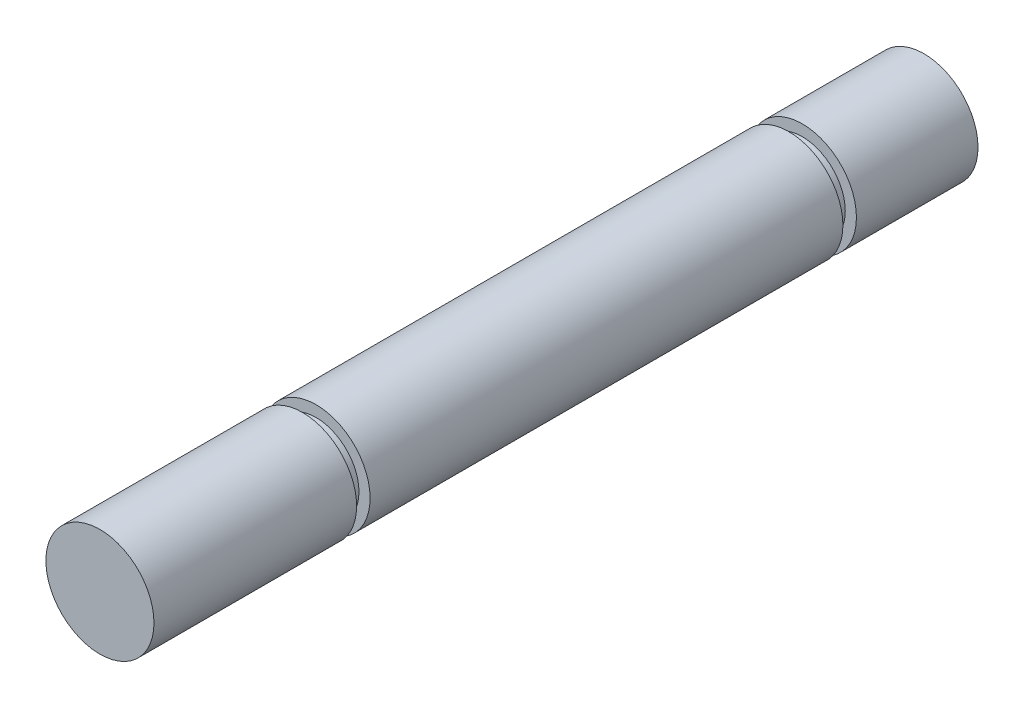
ISO-10303-21;
HEADER;
FILE_DESCRIPTION(('STEP AP214'),'2;1');
FILE_NAME('part.step','',(''),(''),'','','');
FILE_SCHEMA(('AUTOMOTIVE_DESIGN { 1 0 10303 214 1 1 1 1 }'));
ENDSEC;
DATA;
#1=APPLICATION_CONTEXT('core data for automotive mechanical design processes');
#2=APPLICATION_PROTOCOL_DEFINITION('international standard','automotive_design',2000,#1);
#3=PRODUCT_CONTEXT('',#1,'mechanical');
#4=PRODUCT('Part','Part','',(#3));
#5=PRODUCT_RELATED_PRODUCT_CATEGORY('part','',(#4));
#6=PRODUCT_DEFINITION_FORMATION('','',#4);
#7=PRODUCT_DEFINITION_CONTEXT('part definition',#1,'design');
#8=PRODUCT_DEFINITION('design','',#6,#7);
#9=PRODUCT_DEFINITION_SHAPE('','',#8);
#10=(LENGTH_UNIT() NAMED_UNIT(*) SI_UNIT(.MILLI.,.METRE.));
#11=(NAMED_UNIT(*) PLANE_ANGLE_UNIT() SI_UNIT($,.RADIAN.));
#12=(NAMED_UNIT(*) SI_UNIT($,.STERADIAN.) SOLID_ANGLE_UNIT());
#13=UNCERTAINTY_MEASURE_WITH_UNIT(LENGTH_MEASURE(1.E-05),#10,'distance_accuracy_value','');
#14=(GEOMETRIC_REPRESENTATION_CONTEXT(3) GLOBAL_UNCERTAINTY_ASSIGNED_CONTEXT((#13)) GLOBAL_UNIT_ASSIGNED_CONTEXT((#10,
#11,#12)) REPRESENTATION_CONTEXT('',''));
#15=CARTESIAN_POINT('',(0.,0.,0.));
#16=DIRECTION('',(0.,0.,1.));
#17=DIRECTION('',(1.,0.,0.));
#18=AXIS2_PLACEMENT_3D('',#15,#16,#17);
#19=CARTESIAN_POINT('',(0.,4.,16.));
#20=DIRECTION('',(0.,0.,-1.));
#21=DIRECTION('',(1.,0.,0.));
#22=AXIS2_PLACEMENT_3D('',#19,#20,#21);
#23=PLANE('',#22);
#24=CARTESIAN_POINT('',(0.,0.,16.));
#25=DIRECTION('',(0.,0.,1.));
#26=DIRECTION('',(1.,0.,0.));
#27=AXIS2_PLACEMENT_3D('',#24,#25,#26);
#28=CIRCLE('',#27,4.);
#29=CARTESIAN_POINT('',(4.00000000000001,0.,16.));
#30=VERTEX_POINT('',#29);
#31=EDGE_CURVE('E37',#30,#30,#28,.T.);
#32=ORIENTED_EDGE('',*,*,#31,.T.);
#33=EDGE_LOOP('',(#32));
#34=FACE_BOUND('',#33,.T.);
#35=ADVANCED_FACE('F34',(#34),#23,.F.);
#36=CARTESIAN_POINT('',(0.,4.,-45.));
#37=DIRECTION('',(0.,0.,-1.));
#38=DIRECTION('',(1.,0.,0.));
#39=AXIS2_PLACEMENT_3D('',#36,#37,#38);
#40=PLANE('',#39);
#41=CARTESIAN_POINT('',(0.,0.,-45.));
#42=DIRECTION('',(0.,0.,1.));
#43=DIRECTION('',(1.,0.,0.));
#44=AXIS2_PLACEMENT_3D('',#41,#42,#43);
#45=CIRCLE('',#44,4.);
#46=CARTESIAN_POINT('',(4.00000000000001,0.,-45.));
#47=VERTEX_POINT('',#46);
#48=EDGE_CURVE('E52',#47,#47,#45,.F.);
#49=ORIENTED_EDGE('',*,*,#48,.T.);
#50=EDGE_LOOP('',(#49));
#51=FACE_BOUND('',#50,.T.);
#52=ADVANCED_FACE('F107',(#51),#40,.T.);
#53=CARTESIAN_POINT('',(0.,0.,-45.002));
#54=DIRECTION('',(0.,0.,-1.));
#55=DIRECTION('',(1.,0.,0.));
#56=AXIS2_PLACEMENT_3D('',#53,#54,#55);
#57=CYLINDRICAL_SURFACE('',#56,4.);
#58=ORIENTED_EDGE('',*,*,#31,.F.);
#59=EDGE_LOOP('',(#58));
#60=FACE_BOUND('',#59,.T.);
#61=CARTESIAN_POINT('',(0.,0.,1.));
#62=DIRECTION('',(0.,0.,1.));
#63=DIRECTION('',(1.,0.,0.));
#64=AXIS2_PLACEMENT_3D('',#61,#62,#63);
#65=CIRCLE('',#64,4.);
#66=CARTESIAN_POINT('',(-3.99999999999999,0.,1.));
#67=VERTEX_POINT('',#66);
#68=EDGE_CURVE('E98',#67,#67,#65,.F.);
#69=ORIENTED_EDGE('',*,*,#68,.F.);
#70=EDGE_LOOP('',(#69));
#71=FACE_BOUND('',#70,.T.);
#72=ADVANCED_FACE('F104',(#60,#71),#57,.T.);
#73=CARTESIAN_POINT('',(0.,0.,-45.002));
#74=DIRECTION('',(0.,0.,-1.));
#75=DIRECTION('',(1.,0.,0.));
#76=AXIS2_PLACEMENT_3D('',#73,#74,#75);
#77=CYLINDRICAL_SURFACE('',#76,4.);
#78=ORIENTED_EDGE('',*,*,#48,.F.);
#79=EDGE_LOOP('',(#78));
#80=FACE_BOUND('',#79,.T.);
#81=CARTESIAN_POINT('',(0.,0.,-36.));
#82=DIRECTION('',(0.,0.,1.));
#83=DIRECTION('',(1.,0.,0.));
#84=AXIS2_PLACEMENT_3D('',#81,#82,#83);
#85=CIRCLE('',#84,4.);
#86=CARTESIAN_POINT('',(4.00000000000001,0.,-36.));
#87=VERTEX_POINT('',#86);
#88=EDGE_CURVE('E96',#87,#87,#85,.T.);
#89=ORIENTED_EDGE('',*,*,#88,.F.);
#90=EDGE_LOOP('',(#89));
#91=FACE_BOUND('',#90,.T.);
#92=ADVANCED_FACE('F106',(#80,#91),#77,.T.);
#93=CARTESIAN_POINT('',(0.,4.,1.));
#94=DIRECTION('',(0.,0.,1.));
#95=DIRECTION('',(-1.,0.,0.));
#96=AXIS2_PLACEMENT_3D('',#93,#94,#95);
#97=PLANE('',#96);
#98=ORIENTED_EDGE('',*,*,#68,.T.);
#99=EDGE_LOOP('',(#98));
#100=FACE_BOUND('',#99,.T.);
#101=CARTESIAN_POINT('',(0.,0.,1.));
#102=DIRECTION('',(0.,0.,-1.));
#103=DIRECTION('',(-1.,0.,0.));
#104=AXIS2_PLACEMENT_3D('',#101,#102,#103);
#105=CIRCLE('',#104,3.175);
#106=CARTESIAN_POINT('',(-3.17499999999999,0.,1.));
#107=VERTEX_POINT('',#106);
#108=EDGE_CURVE('E94',#107,#107,#105,.F.);
#109=ORIENTED_EDGE('',*,*,#108,.T.);
#110=EDGE_LOOP('',(#109));
#111=FACE_BOUND('',#110,.T.);
#112=ADVANCED_FACE('F101',(#100,#111),#97,.F.);
#113=CARTESIAN_POINT('',(0.,4.,-36.));
#114=DIRECTION('',(0.,0.,-1.));
#115=DIRECTION('',(1.,0.,0.));
#116=AXIS2_PLACEMENT_3D('',#113,#114,#115);
#117=PLANE('',#116);
#118=CARTESIAN_POINT('',(0.,0.,-36.));
#119=DIRECTION('',(0.,0.,1.));
#120=DIRECTION('',(1.,0.,0.));
#121=AXIS2_PLACEMENT_3D('',#118,#119,#120);
#122=CIRCLE('',#121,3.175);
#123=CARTESIAN_POINT('',(3.17500000000001,0.,-36.));
#124=VERTEX_POINT('',#123);
#125=EDGE_CURVE('E92',#124,#124,#122,.F.);
#126=ORIENTED_EDGE('',*,*,#125,.T.);
#127=EDGE_LOOP('',(#126));
#128=FACE_BOUND('',#127,.T.);
#129=ORIENTED_EDGE('',*,*,#88,.T.);
#130=EDGE_LOOP('',(#129));
#131=FACE_BOUND('',#130,.T.);
#132=ADVANCED_FACE('F144',(#128,#131),#117,.F.);
#133=CARTESIAN_POINT('',(0.,0.,1.002));
#134=DIRECTION('',(0.,0.,1.));
#135=DIRECTION('',(-1.,0.,0.));
#136=AXIS2_PLACEMENT_3D('',#133,#134,#135);
#137=CYLINDRICAL_SURFACE('',#136,3.175);
#138=ORIENTED_EDGE('',*,*,#108,.F.);
#139=EDGE_LOOP('',(#138));
#140=FACE_BOUND('',#139,.T.);
#141=CARTESIAN_POINT('',(0.,0.,0.));
#142=DIRECTION('',(0.,0.,-1.));
#143=DIRECTION('',(-1.,0.,0.));
#144=AXIS2_PLACEMENT_3D('',#141,#142,#143);
#145=CIRCLE('',#144,3.175);
#146=CARTESIAN_POINT('',(3.17500000000001,0.,0.));
#147=VERTEX_POINT('',#146);
#148=EDGE_CURVE('E88',#147,#147,#145,.T.);
#149=ORIENTED_EDGE('',*,*,#148,.F.);
#150=EDGE_LOOP('',(#149));
#151=FACE_BOUND('',#150,.T.);
#152=ADVANCED_FACE('F153',(#140,#151),#137,.T.);
#153=CARTESIAN_POINT('',(0.,0.,-36.002));
#154=DIRECTION('',(0.,0.,-1.));
#155=DIRECTION('',(1.,0.,0.));
#156=AXIS2_PLACEMENT_3D('',#153,#154,#155);
#157=CYLINDRICAL_SURFACE('',#156,3.175);
#158=ORIENTED_EDGE('',*,*,#125,.F.);
#159=EDGE_LOOP('',(#158));
#160=FACE_BOUND('',#159,.T.);
#161=CARTESIAN_POINT('',(0.,0.,-35.));
#162=DIRECTION('',(0.,0.,1.));
#163=DIRECTION('',(1.,0.,0.));
#164=AXIS2_PLACEMENT_3D('',#161,#162,#163);
#165=CIRCLE('',#164,3.175);
#166=CARTESIAN_POINT('',(3.17500000000001,0.,-35.));
#167=VERTEX_POINT('',#166);
#168=EDGE_CURVE('E86',#167,#167,#165,.F.);
#169=ORIENTED_EDGE('',*,*,#168,.T.);
#170=EDGE_LOOP('',(#169));
#171=FACE_BOUND('',#170,.T.);
#172=ADVANCED_FACE('F163',(#160,#171),#157,.T.);
#173=CARTESIAN_POINT('',(-7.75,-59.1416059881449,0.));
#174=DIRECTION('',(0.,0.,-1.));
#175=DIRECTION('',(1.,0.,0.));
#176=AXIS2_PLACEMENT_3D('',#173,#174,#175);
#177=PLANE('',#176);
#178=CARTESIAN_POINT('',(0.,0.,0.));
#179=DIRECTION('',(0.,0.,1.));
#180=DIRECTION('',(1.,0.,0.));
#181=AXIS2_PLACEMENT_3D('',#178,#179,#180);
#182=CIRCLE('',#181,4.);
#183=CARTESIAN_POINT('',(4.00000000000001,0.,0.));
#184=VERTEX_POINT('',#183);
#185=EDGE_CURVE('E42',#184,#184,#182,.T.);
#186=ORIENTED_EDGE('',*,*,#185,.T.);
#187=EDGE_LOOP('',(#186));
#188=FACE_BOUND('',#187,.T.);
#189=ORIENTED_EDGE('',*,*,#148,.T.);
#190=EDGE_LOOP('',(#189));
#191=FACE_BOUND('',#190,.T.);
#192=ADVANCED_FACE('F173',(#188,#191),#177,.F.);
#193=CARTESIAN_POINT('',(0.,11.,-35.));
#194=DIRECTION('',(0.,0.,-1.));
#195=DIRECTION('',(1.,0.,0.));
#196=AXIS2_PLACEMENT_3D('',#193,#194,#195);
#197=PLANE('',#196);
#198=CARTESIAN_POINT('',(0.,0.,-35.));
#199=DIRECTION('',(0.,0.,1.));
#200=DIRECTION('',(1.,0.,0.));
#201=AXIS2_PLACEMENT_3D('',#198,#199,#200);
#202=CIRCLE('',#201,4.);
#203=CARTESIAN_POINT('',(4.00000000000001,0.,-35.));
#204=VERTEX_POINT('',#203);
#205=EDGE_CURVE('E11',#204,#204,#202,.F.);
#206=ORIENTED_EDGE('',*,*,#205,.T.);
#207=EDGE_LOOP('',(#206));
#208=FACE_BOUND('',#207,.T.);
#209=ORIENTED_EDGE('',*,*,#168,.F.);
#210=EDGE_LOOP('',(#209));
#211=FACE_BOUND('',#210,.T.);
#212=ADVANCED_FACE('F77',(#208,#211),#197,.T.);
#213=CARTESIAN_POINT('',(0.,0.,-45.002));
#214=DIRECTION('',(0.,0.,-1.));
#215=DIRECTION('',(1.,0.,0.));
#216=AXIS2_PLACEMENT_3D('',#213,#214,#215);
#217=CYLINDRICAL_SURFACE('',#216,4.);
#218=ORIENTED_EDGE('',*,*,#205,.F.);
#219=EDGE_LOOP('',(#218));
#220=FACE_BOUND('',#219,.T.);
#221=ORIENTED_EDGE('',*,*,#185,.F.);
#222=EDGE_LOOP('',(#221));
#223=FACE_BOUND('',#222,.T.);
#224=ADVANCED_FACE('F80',(#220,#223),#217,.T.);
#225=CLOSED_SHELL('',(#35,#52,#72,#92,#112,#132,#152,#172,#192,#212,#224));
#226=MANIFOLD_SOLID_BREP('B2',#225);
#227=ADVANCED_BREP_SHAPE_REPRESENTATION('',(#18,#226),#14);
#228=SHAPE_DEFINITION_REPRESENTATION(#9,#227);
ENDSEC;
END-ISO-10303-21;
